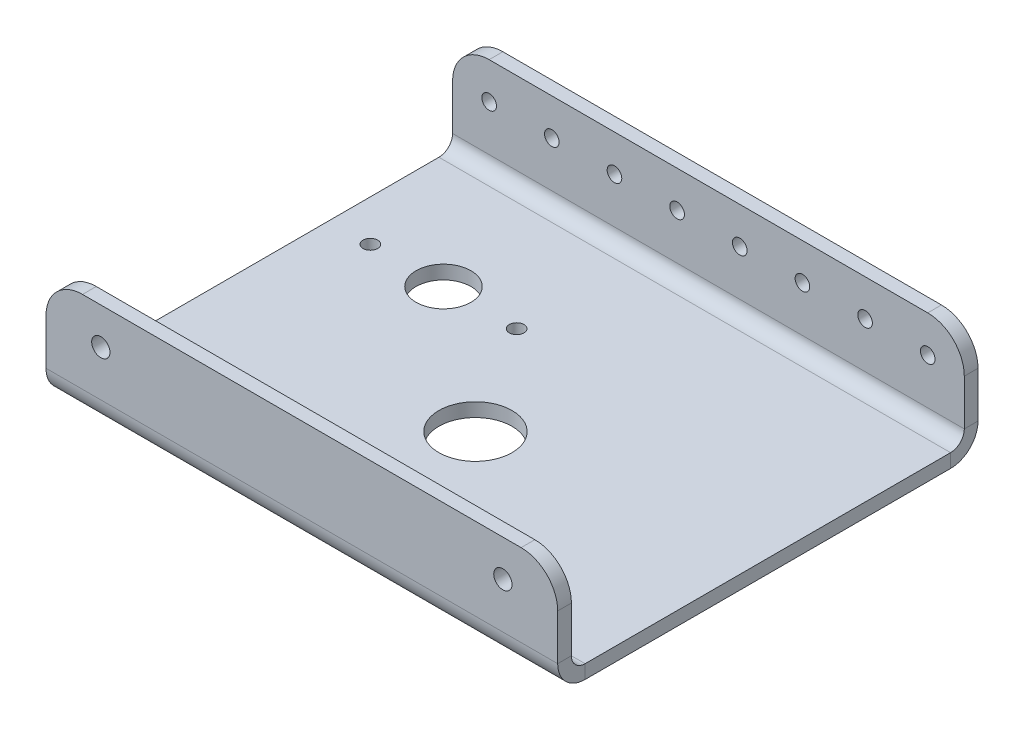
ISO-10303-21;
HEADER;
FILE_DESCRIPTION(('STEP AP214'),'2;1');
FILE_NAME('part.step','',(''),(''),'','','');
FILE_SCHEMA(('AUTOMOTIVE_DESIGN { 1 0 10303 214 1 1 1 1 }'));
ENDSEC;
DATA;
#1=APPLICATION_CONTEXT('core data for automotive mechanical design processes');
#2=APPLICATION_PROTOCOL_DEFINITION('international standard','automotive_design',2000,#1);
#3=PRODUCT_CONTEXT('',#1,'mechanical');
#4=PRODUCT('Part','Part','',(#3));
#5=PRODUCT_RELATED_PRODUCT_CATEGORY('part','',(#4));
#6=PRODUCT_DEFINITION_FORMATION('','',#4);
#7=PRODUCT_DEFINITION_CONTEXT('part definition',#1,'design');
#8=PRODUCT_DEFINITION('design','',#6,#7);
#9=PRODUCT_DEFINITION_SHAPE('','',#8);
#10=(LENGTH_UNIT() NAMED_UNIT(*) SI_UNIT(.MILLI.,.METRE.));
#11=(NAMED_UNIT(*) PLANE_ANGLE_UNIT() SI_UNIT($,.RADIAN.));
#12=(NAMED_UNIT(*) SI_UNIT($,.STERADIAN.) SOLID_ANGLE_UNIT());
#13=UNCERTAINTY_MEASURE_WITH_UNIT(LENGTH_MEASURE(1.E-05),#10,'distance_accuracy_value','');
#14=(GEOMETRIC_REPRESENTATION_CONTEXT(3) GLOBAL_UNCERTAINTY_ASSIGNED_CONTEXT((#13)) GLOBAL_UNIT_ASSIGNED_CONTEXT((#10,
#11,#12)) REPRESENTATION_CONTEXT('',''));
#15=CARTESIAN_POINT('',(0.,0.,0.));
#16=DIRECTION('',(0.,0.,1.));
#17=DIRECTION('',(1.,0.,0.));
#18=AXIS2_PLACEMENT_3D('',#15,#16,#17);
#19=CARTESIAN_POINT('',(-88.9,3.175,63.5));
#20=DIRECTION('',(1.,0.,0.));
#21=DIRECTION('',(0.,0.,1.));
#22=AXIS2_PLACEMENT_3D('',#19,#20,#21);
#23=PLANE('',#22);
#24=DIRECTION('',(0.,1.,0.));
#25=VECTOR('',#24,1.);
#26=CARTESIAN_POINT('',(-88.9,3.175,-63.5));
#27=LINE('',#26,#25);
#28=CARTESIAN_POINT('',(-88.9,-1.58750000000006,-63.5));
#29=VERTEX_POINT('',#28);
#30=CARTESIAN_POINT('',(-88.9,3.175,-63.5));
#31=VERTEX_POINT('',#30);
#32=EDGE_CURVE('E312',#29,#31,#27,.T.);
#33=ORIENTED_EDGE('',*,*,#32,.F.);
#34=DIRECTION('',(0.,0.,-1.));
#35=VECTOR('',#34,1.);
#36=CARTESIAN_POINT('',(-88.9,-1.5875,0.));
#37=LINE('',#36,#35);
#38=CARTESIAN_POINT('',(-88.9,-1.5875,63.5));
#39=VERTEX_POINT('',#38);
#40=EDGE_CURVE('E304',#29,#39,#37,.F.);
#41=ORIENTED_EDGE('',*,*,#40,.T.);
#42=DIRECTION('',(0.,1.,0.));
#43=VECTOR('',#42,1.);
#44=CARTESIAN_POINT('',(-88.9,3.175,63.5));
#45=LINE('',#44,#43);
#46=CARTESIAN_POINT('',(-88.9,3.175,63.5));
#47=VERTEX_POINT('',#46);
#48=EDGE_CURVE('E310',#39,#47,#45,.T.);
#49=ORIENTED_EDGE('',*,*,#48,.T.);
#50=DIRECTION('',(0.,0.,1.));
#51=VECTOR('',#50,1.);
#52=CARTESIAN_POINT('',(-88.9,3.175,63.5));
#53=LINE('',#52,#51);
#54=EDGE_CURVE('E293',#31,#47,#53,.T.);
#55=ORIENTED_EDGE('',*,*,#54,.F.);
#56=EDGE_LOOP('',(#33,#41,#49,#55));
#57=FACE_BOUND('',#56,.T.);
#58=ADVANCED_FACE('F77',(#57),#23,.F.);
#59=CARTESIAN_POINT('',(88.9,3.175,63.5));
#60=DIRECTION('',(-1.,0.,0.));
#61=DIRECTION('',(0.,0.,-1.));
#62=AXIS2_PLACEMENT_3D('',#59,#60,#61);
#63=PLANE('',#62);
#64=DIRECTION('',(0.,1.,0.));
#65=VECTOR('',#64,1.);
#66=CARTESIAN_POINT('',(88.9,3.175,63.5));
#67=LINE('',#66,#65);
#68=CARTESIAN_POINT('',(88.9,-1.58750000000001,63.5));
#69=VERTEX_POINT('',#68);
#70=CARTESIAN_POINT('',(88.9,3.175,63.5));
#71=VERTEX_POINT('',#70);
#72=EDGE_CURVE('E308',#69,#71,#67,.T.);
#73=ORIENTED_EDGE('',*,*,#72,.F.);
#74=DIRECTION('',(0.,0.,-1.));
#75=VECTOR('',#74,1.);
#76=CARTESIAN_POINT('',(88.9,-1.5875,0.));
#77=LINE('',#76,#75);
#78=CARTESIAN_POINT('',(88.9,-1.5875,-63.5));
#79=VERTEX_POINT('',#78);
#80=EDGE_CURVE('E279',#69,#79,#77,.T.);
#81=ORIENTED_EDGE('',*,*,#80,.T.);
#82=DIRECTION('',(0.,1.,0.));
#83=VECTOR('',#82,1.);
#84=CARTESIAN_POINT('',(88.9,3.175,-63.5));
#85=LINE('',#84,#83);
#86=CARTESIAN_POINT('',(88.9,3.175,-63.5));
#87=VERTEX_POINT('',#86);
#88=EDGE_CURVE('E299',#79,#87,#85,.T.);
#89=ORIENTED_EDGE('',*,*,#88,.T.);
#90=DIRECTION('',(0.,0.,-1.));
#91=VECTOR('',#90,1.);
#92=CARTESIAN_POINT('',(88.9,3.175,63.5));
#93=LINE('',#92,#91);
#94=EDGE_CURVE('E288',#71,#87,#93,.T.);
#95=ORIENTED_EDGE('',*,*,#94,.F.);
#96=EDGE_LOOP('',(#73,#81,#89,#95));
#97=FACE_BOUND('',#96,.T.);
#98=ADVANCED_FACE('F411',(#97),#63,.F.);
#99=CARTESIAN_POINT('',(0.,3.175,0.));
#100=DIRECTION('',(0.,-1.,0.));
#101=DIRECTION('',(0.,0.,-1.));
#102=AXIS2_PLACEMENT_3D('',#99,#100,#101);
#103=PLANE('',#102);
#104=CARTESIAN_POINT('',(-74.6032813946387,3.175,-25.4));
#105=DIRECTION('',(0.,-1.,0.));
#106=DIRECTION('',(0.,0.,-1.));
#107=AXIS2_PLACEMENT_3D('',#104,#105,#106);
#108=CIRCLE('',#107,2.53999999999998);
#109=CARTESIAN_POINT('',(-74.6032813946387,3.175,-27.94));
#110=VERTEX_POINT('',#109);
#111=EDGE_CURVE('E866',#110,#110,#108,.T.);
#112=ORIENTED_EDGE('',*,*,#111,.T.);
#113=EDGE_LOOP('',(#112));
#114=FACE_BOUND('',#113,.T.);
#115=CARTESIAN_POINT('',(-23.8032813946387,3.175,-25.4));
#116=DIRECTION('',(0.,-1.,0.));
#117=DIRECTION('',(0.,0.,-1.));
#118=AXIS2_PLACEMENT_3D('',#115,#116,#117);
#119=CIRCLE('',#118,2.54);
#120=CARTESIAN_POINT('',(-23.8032813946387,3.175,-27.94));
#121=VERTEX_POINT('',#120);
#122=EDGE_CURVE('E870',#121,#121,#119,.T.);
#123=ORIENTED_EDGE('',*,*,#122,.T.);
#124=EDGE_LOOP('',(#123));
#125=FACE_BOUND('',#124,.T.);
#126=CARTESIAN_POINT('',(-49.2032813946387,3.175,-25.4));
#127=DIRECTION('',(0.,-1.,0.));
#128=DIRECTION('',(0.,0.,-1.));
#129=AXIS2_PLACEMENT_3D('',#126,#127,#128);
#130=CIRCLE('',#129,9.525);
#131=CARTESIAN_POINT('',(-49.2032813946387,3.175,-34.925));
#132=VERTEX_POINT('',#131);
#133=EDGE_CURVE('E874',#132,#132,#130,.T.);
#134=ORIENTED_EDGE('',*,*,#133,.T.);
#135=EDGE_LOOP('',(#134));
#136=FACE_BOUND('',#135,.T.);
#137=CARTESIAN_POINT('',(0.,3.175,12.7));
#138=DIRECTION('',(0.,-1.,0.));
#139=DIRECTION('',(0.,0.,-1.));
#140=AXIS2_PLACEMENT_3D('',#137,#138,#139);
#141=CIRCLE('',#140,12.7);
#142=CARTESIAN_POINT('',(0.,3.175,0.));
#143=VERTEX_POINT('',#142);
#144=EDGE_CURVE('E877',#143,#143,#141,.T.);
#145=ORIENTED_EDGE('',*,*,#144,.T.);
#146=EDGE_LOOP('',(#145));
#147=FACE_BOUND('',#146,.T.);
#148=ORIENTED_EDGE('',*,*,#94,.T.);
#149=DIRECTION('',(-1.,0.,0.));
#150=VECTOR('',#149,1.);
#151=CARTESIAN_POINT('',(-88.9,3.175,-63.5));
#152=LINE('',#151,#150);
#153=EDGE_CURVE('E291',#87,#31,#152,.T.);
#154=ORIENTED_EDGE('',*,*,#153,.T.);
#155=ORIENTED_EDGE('',*,*,#54,.T.);
#156=DIRECTION('',(1.,0.,0.));
#157=VECTOR('',#156,1.);
#158=CARTESIAN_POINT('',(-88.9,3.175,63.5));
#159=LINE('',#158,#157);
#160=EDGE_CURVE('E296',#47,#71,#159,.T.);
#161=ORIENTED_EDGE('',*,*,#160,.T.);
#162=EDGE_LOOP('',(#148,#154,#155,#161));
#163=FACE_BOUND('',#162,.T.);
#164=ADVANCED_FACE('F414',(#114,#125,#136,#147,#163),#103,.F.);
#165=CARTESIAN_POINT('',(0.,-1.5875,0.));
#166=DIRECTION('',(0.,-1.,0.));
#167=DIRECTION('',(0.,0.,-1.));
#168=AXIS2_PLACEMENT_3D('',#165,#166,#167);
#169=PLANE('',#168);
#170=CARTESIAN_POINT('',(-74.6032813946387,-1.5875,-25.4));
#171=DIRECTION('',(0.,-1.,0.));
#172=DIRECTION('',(0.,0.,-1.));
#173=AXIS2_PLACEMENT_3D('',#170,#171,#172);
#174=CIRCLE('',#173,2.53999999999998);
#175=CARTESIAN_POINT('',(-74.6032813946387,-1.5875,-27.94));
#176=VERTEX_POINT('',#175);
#177=EDGE_CURVE('E962',#176,#176,#174,.T.);
#178=ORIENTED_EDGE('',*,*,#177,.F.);
#179=EDGE_LOOP('',(#178));
#180=FACE_BOUND('',#179,.T.);
#181=CARTESIAN_POINT('',(-23.8032813946387,-1.5875,-25.4));
#182=DIRECTION('',(0.,-1.,0.));
#183=DIRECTION('',(0.,0.,-1.));
#184=AXIS2_PLACEMENT_3D('',#181,#182,#183);
#185=CIRCLE('',#184,2.54);
#186=CARTESIAN_POINT('',(-23.8032813946387,-1.5875,-27.94));
#187=VERTEX_POINT('',#186);
#188=EDGE_CURVE('E958',#187,#187,#185,.T.);
#189=ORIENTED_EDGE('',*,*,#188,.F.);
#190=EDGE_LOOP('',(#189));
#191=FACE_BOUND('',#190,.T.);
#192=CARTESIAN_POINT('',(-49.2032813946387,-1.5875,-25.4));
#193=DIRECTION('',(0.,-1.,0.));
#194=DIRECTION('',(0.,0.,-1.));
#195=AXIS2_PLACEMENT_3D('',#192,#193,#194);
#196=CIRCLE('',#195,9.525);
#197=CARTESIAN_POINT('',(-49.2032813946387,-1.5875,-34.925));
#198=VERTEX_POINT('',#197);
#199=EDGE_CURVE('E954',#198,#198,#196,.T.);
#200=ORIENTED_EDGE('',*,*,#199,.F.);
#201=EDGE_LOOP('',(#200));
#202=FACE_BOUND('',#201,.T.);
#203=CARTESIAN_POINT('',(0.,-1.5875,12.7));
#204=DIRECTION('',(0.,-1.,0.));
#205=DIRECTION('',(0.,0.,-1.));
#206=AXIS2_PLACEMENT_3D('',#203,#204,#205);
#207=CIRCLE('',#206,12.7);
#208=CARTESIAN_POINT('',(0.,-1.5875,0.));
#209=VERTEX_POINT('',#208);
#210=EDGE_CURVE('E880',#209,#209,#207,.T.);
#211=ORIENTED_EDGE('',*,*,#210,.F.);
#212=EDGE_LOOP('',(#211));
#213=FACE_BOUND('',#212,.T.);
#214=ORIENTED_EDGE('',*,*,#80,.F.);
#215=DIRECTION('',(1.,0.,0.));
#216=VECTOR('',#215,1.);
#217=CARTESIAN_POINT('',(0.,-1.5875,63.5));
#218=LINE('',#217,#216);
#219=EDGE_CURVE('E201',#39,#69,#218,.T.);
#220=ORIENTED_EDGE('',*,*,#219,.F.);
#221=ORIENTED_EDGE('',*,*,#40,.F.);
#222=DIRECTION('',(1.,0.,0.));
#223=VECTOR('',#222,1.);
#224=CARTESIAN_POINT('',(0.,-1.5875,-63.5));
#225=LINE('',#224,#223);
#226=EDGE_CURVE('E302',#79,#29,#225,.F.);
#227=ORIENTED_EDGE('',*,*,#226,.F.);
#228=EDGE_LOOP('',(#214,#220,#221,#227));
#229=FACE_BOUND('',#228,.T.);
#230=ADVANCED_FACE('F700',(#180,#191,#202,#213,#229),#169,.T.);
#231=CARTESIAN_POINT('',(88.9,7.93749999999995,-63.5));
#232=DIRECTION('',(1.,0.,0.));
#233=DIRECTION('',(0.,0.,-1.));
#234=AXIS2_PLACEMENT_3D('',#231,#232,#233);
#235=PLANE('',#234);
#236=DIRECTION('',(0.,0.,1.));
#237=VECTOR('',#236,1.);
#238=CARTESIAN_POINT('',(88.9,7.93750000000001,-73.0249999999999));
#239=LINE('',#238,#237);
#240=CARTESIAN_POINT('',(88.9,7.93749999999993,-68.2625));
#241=VERTEX_POINT('',#240);
#242=CARTESIAN_POINT('',(88.9,7.93749999999991,-73.025));
#243=VERTEX_POINT('',#242);
#244=EDGE_CURVE('E248',#241,#243,#239,.F.);
#245=ORIENTED_EDGE('',*,*,#244,.F.);
#246=CARTESIAN_POINT('',(88.9,7.93749999999995,-63.5));
#247=DIRECTION('',(-1.,0.,0.));
#248=DIRECTION('',(0.,0.,1.));
#249=AXIS2_PLACEMENT_3D('',#246,#247,#248);
#250=CIRCLE('',#249,4.7625);
#251=EDGE_CURVE('E283',#87,#241,#250,.F.);
#252=ORIENTED_EDGE('',*,*,#251,.F.);
#253=ORIENTED_EDGE('',*,*,#88,.F.);
#254=CARTESIAN_POINT('',(88.9,7.93749999999995,-63.5));
#255=DIRECTION('',(-1.,0.,0.));
#256=DIRECTION('',(0.,0.,1.));
#257=AXIS2_PLACEMENT_3D('',#254,#255,#256);
#258=CIRCLE('',#257,9.525);
#259=EDGE_CURVE('E276',#79,#243,#258,.F.);
#260=ORIENTED_EDGE('',*,*,#259,.T.);
#261=EDGE_LOOP('',(#245,#252,#253,#260));
#262=FACE_BOUND('',#261,.T.);
#263=ADVANCED_FACE('F407',(#262),#235,.T.);
#264=CARTESIAN_POINT('',(-88.9,7.93749999999995,-63.5));
#265=DIRECTION('',(1.,0.,0.));
#266=DIRECTION('',(0.,0.,-1.));
#267=AXIS2_PLACEMENT_3D('',#264,#265,#266);
#268=PLANE('',#267);
#269=CARTESIAN_POINT('',(-88.9,7.93749999999995,-63.5));
#270=DIRECTION('',(-1.,0.,0.));
#271=DIRECTION('',(0.,0.,1.));
#272=AXIS2_PLACEMENT_3D('',#269,#270,#271);
#273=CIRCLE('',#272,4.7625);
#274=CARTESIAN_POINT('',(-88.9,7.93749999999993,-68.2625));
#275=VERTEX_POINT('',#274);
#276=EDGE_CURVE('E255',#275,#31,#273,.T.);
#277=ORIENTED_EDGE('',*,*,#276,.F.);
#278=DIRECTION('',(0.,0.,1.));
#279=VECTOR('',#278,1.);
#280=CARTESIAN_POINT('',(-88.9,7.93749999999998,-68.2625));
#281=LINE('',#280,#279);
#282=CARTESIAN_POINT('',(-88.9,7.93750000000001,-73.025));
#283=VERTEX_POINT('',#282);
#284=EDGE_CURVE('E269',#275,#283,#281,.F.);
#285=ORIENTED_EDGE('',*,*,#284,.T.);
#286=CARTESIAN_POINT('',(-88.9,7.93749999999995,-63.5));
#287=DIRECTION('',(-1.,0.,0.));
#288=DIRECTION('',(0.,0.,1.));
#289=AXIS2_PLACEMENT_3D('',#286,#287,#288);
#290=CIRCLE('',#289,9.525);
#291=EDGE_CURVE('E280',#283,#29,#290,.T.);
#292=ORIENTED_EDGE('',*,*,#291,.T.);
#293=ORIENTED_EDGE('',*,*,#32,.T.);
#294=EDGE_LOOP('',(#277,#285,#292,#293));
#295=FACE_BOUND('',#294,.T.);
#296=ADVANCED_FACE('F401',(#295),#268,.F.);
#297=CARTESIAN_POINT('',(-88.9,7.93749999999995,-63.5));
#298=DIRECTION('',(-1.,0.,0.));
#299=DIRECTION('',(0.,0.,-1.));
#300=AXIS2_PLACEMENT_3D('',#297,#298,#299);
#301=CYLINDRICAL_SURFACE('',#300,9.525);
#302=ORIENTED_EDGE('',*,*,#226,.T.);
#303=ORIENTED_EDGE('',*,*,#291,.F.);
#304=DIRECTION('',(-1.,0.,0.));
#305=VECTOR('',#304,1.);
#306=CARTESIAN_POINT('',(88.9,7.93750000000001,-73.025));
#307=LINE('',#306,#305);
#308=EDGE_CURVE('E266',#283,#243,#307,.F.);
#309=ORIENTED_EDGE('',*,*,#308,.T.);
#310=ORIENTED_EDGE('',*,*,#259,.F.);
#311=EDGE_LOOP('',(#302,#303,#309,#310));
#312=FACE_BOUND('',#311,.T.);
#313=ADVANCED_FACE('F404',(#312),#301,.T.);
#314=CARTESIAN_POINT('',(-88.9,7.93749999999995,-63.5));
#315=DIRECTION('',(-1.,0.,0.));
#316=DIRECTION('',(0.,0.,-1.));
#317=AXIS2_PLACEMENT_3D('',#314,#315,#316);
#318=CYLINDRICAL_SURFACE('',#317,4.7625);
#319=ORIENTED_EDGE('',*,*,#153,.F.);
#320=ORIENTED_EDGE('',*,*,#251,.T.);
#321=DIRECTION('',(-1.,0.,0.));
#322=VECTOR('',#321,1.);
#323=CARTESIAN_POINT('',(88.9,7.93749999999998,-68.2625));
#324=LINE('',#323,#322);
#325=EDGE_CURVE('E272',#241,#275,#324,.T.);
#326=ORIENTED_EDGE('',*,*,#325,.T.);
#327=ORIENTED_EDGE('',*,*,#276,.T.);
#328=EDGE_LOOP('',(#319,#320,#326,#327));
#329=FACE_BOUND('',#328,.T.);
#330=ADVANCED_FACE('F418',(#329),#318,.F.);
#331=CARTESIAN_POINT('',(88.9,3.17499999999998,-73.025));
#332=DIRECTION('',(-1.,0.,0.));
#333=DIRECTION('',(0.,0.,1.));
#334=AXIS2_PLACEMENT_3D('',#331,#332,#333);
#335=PLANE('',#334);
#336=DIRECTION('',(0.,-1.,0.));
#337=VECTOR('',#336,1.);
#338=CARTESIAN_POINT('',(88.9,-2.28099232185794E-13,-73.025));
#339=LINE('',#338,#337);
#340=CARTESIAN_POINT('',(88.9,23.8125,-73.025));
#341=VERTEX_POINT('',#340);
#342=EDGE_CURVE('E258',#341,#243,#339,.T.);
#343=ORIENTED_EDGE('',*,*,#342,.F.);
#344=DIRECTION('',(0.,0.,1.));
#345=VECTOR('',#344,1.);
#346=CARTESIAN_POINT('',(88.9,23.8125,-73.025));
#347=LINE('',#346,#345);
#348=CARTESIAN_POINT('',(88.9,23.8125,-68.2625));
#349=VERTEX_POINT('',#348);
#350=EDGE_CURVE('E364',#341,#349,#347,.T.);
#351=ORIENTED_EDGE('',*,*,#350,.T.);
#352=DIRECTION('',(0.,1.,0.));
#353=VECTOR('',#352,1.);
#354=CARTESIAN_POINT('',(88.9,3.175,-68.2625));
#355=LINE('',#354,#353);
#356=EDGE_CURVE('E264',#349,#241,#355,.F.);
#357=ORIENTED_EDGE('',*,*,#356,.T.);
#358=ORIENTED_EDGE('',*,*,#244,.T.);
#359=EDGE_LOOP('',(#343,#351,#357,#358));
#360=FACE_BOUND('',#359,.T.);
#361=ADVANCED_FACE('F384',(#360),#335,.F.);
#362=CARTESIAN_POINT('',(-88.9,36.5125,-73.0250000000001));
#363=DIRECTION('',(1.,0.,0.));
#364=DIRECTION('',(0.,0.,-1.));
#365=AXIS2_PLACEMENT_3D('',#362,#363,#364);
#366=PLANE('',#365);
#367=DIRECTION('',(0.,-1.,0.));
#368=VECTOR('',#367,1.);
#369=CARTESIAN_POINT('',(-88.9,36.5125,-68.2625000000001));
#370=LINE('',#369,#368);
#371=CARTESIAN_POINT('',(-88.9,23.8125,-68.2625));
#372=VERTEX_POINT('',#371);
#373=EDGE_CURVE('E262',#275,#372,#370,.F.);
#374=ORIENTED_EDGE('',*,*,#373,.T.);
#375=DIRECTION('',(0.,0.,1.));
#376=VECTOR('',#375,1.);
#377=CARTESIAN_POINT('',(-88.9,23.8125,-73.025));
#378=LINE('',#377,#376);
#379=CARTESIAN_POINT('',(-88.9,23.8125,-73.025));
#380=VERTEX_POINT('',#379);
#381=EDGE_CURVE('E13',#372,#380,#378,.F.);
#382=ORIENTED_EDGE('',*,*,#381,.T.);
#383=DIRECTION('',(0.,1.,0.));
#384=VECTOR('',#383,1.);
#385=CARTESIAN_POINT('',(-88.9,-2.28099232185794E-13,-73.025));
#386=LINE('',#385,#384);
#387=EDGE_CURVE('E256',#283,#380,#386,.T.);
#388=ORIENTED_EDGE('',*,*,#387,.F.);
#389=ORIENTED_EDGE('',*,*,#284,.F.);
#390=EDGE_LOOP('',(#374,#382,#388,#389));
#391=FACE_BOUND('',#390,.T.);
#392=ADVANCED_FACE('F398',(#391),#366,.F.);
#393=CARTESIAN_POINT('',(0.,-2.28099232185794E-13,-73.025));
#394=DIRECTION('',(0.,0.,1.));
#395=DIRECTION('',(0.,-1.,0.));
#396=AXIS2_PLACEMENT_3D('',#393,#394,#395);
#397=PLANE('',#396);
#398=CARTESIAN_POINT('',(-76.2,23.8125,-73.025));
#399=DIRECTION('',(0.,0.,-1.));
#400=DIRECTION('',(0.,1.,0.));
#401=AXIS2_PLACEMENT_3D('',#398,#399,#400);
#402=CIRCLE('',#401,2.54);
#403=CARTESIAN_POINT('',(-76.2,26.3525,-73.0250000000001));
#404=VERTEX_POINT('',#403);
#405=EDGE_CURVE('E347',#404,#404,#402,.T.);
#406=ORIENTED_EDGE('',*,*,#405,.F.);
#407=EDGE_LOOP('',(#406));
#408=FACE_BOUND('',#407,.T.);
#409=CARTESIAN_POINT('',(-54.4285714285714,23.8125,-73.025));
#410=DIRECTION('',(0.,0.,-1.));
#411=DIRECTION('',(0.,1.,0.));
#412=AXIS2_PLACEMENT_3D('',#409,#410,#411);
#413=CIRCLE('',#412,2.54);
#414=CARTESIAN_POINT('',(-54.4285714285714,26.3525,-73.0250000000001));
#415=VERTEX_POINT('',#414);
#416=EDGE_CURVE('E343',#415,#415,#413,.T.);
#417=ORIENTED_EDGE('',*,*,#416,.F.);
#418=EDGE_LOOP('',(#417));
#419=FACE_BOUND('',#418,.T.);
#420=CARTESIAN_POINT('',(-32.6571428571429,23.8125,-73.025));
#421=DIRECTION('',(0.,0.,-1.));
#422=DIRECTION('',(0.,1.,0.));
#423=AXIS2_PLACEMENT_3D('',#420,#421,#422);
#424=CIRCLE('',#423,2.54);
#425=CARTESIAN_POINT('',(-32.6571428571429,26.3525,-73.0250000000001));
#426=VERTEX_POINT('',#425);
#427=EDGE_CURVE('E339',#426,#426,#424,.T.);
#428=ORIENTED_EDGE('',*,*,#427,.F.);
#429=EDGE_LOOP('',(#428));
#430=FACE_BOUND('',#429,.T.);
#431=CARTESIAN_POINT('',(-10.8857142857143,23.8125,-73.025));
#432=DIRECTION('',(0.,0.,-1.));
#433=DIRECTION('',(0.,1.,0.));
#434=AXIS2_PLACEMENT_3D('',#431,#432,#433);
#435=CIRCLE('',#434,2.54);
#436=CARTESIAN_POINT('',(-10.8857142857143,26.3525,-73.0250000000001));
#437=VERTEX_POINT('',#436);
#438=EDGE_CURVE('E335',#437,#437,#435,.T.);
#439=ORIENTED_EDGE('',*,*,#438,.F.);
#440=EDGE_LOOP('',(#439));
#441=FACE_BOUND('',#440,.T.);
#442=CARTESIAN_POINT('',(10.8857142857143,23.8125,-73.025));
#443=DIRECTION('',(0.,0.,-1.));
#444=DIRECTION('',(0.,1.,0.));
#445=AXIS2_PLACEMENT_3D('',#442,#443,#444);
#446=CIRCLE('',#445,2.54);
#447=CARTESIAN_POINT('',(10.8857142857143,26.3525,-73.0250000000001));
#448=VERTEX_POINT('',#447);
#449=EDGE_CURVE('E331',#448,#448,#446,.T.);
#450=ORIENTED_EDGE('',*,*,#449,.F.);
#451=EDGE_LOOP('',(#450));
#452=FACE_BOUND('',#451,.T.);
#453=CARTESIAN_POINT('',(32.6571428571428,23.8125,-73.025));
#454=DIRECTION('',(0.,0.,-1.));
#455=DIRECTION('',(0.,1.,0.));
#456=AXIS2_PLACEMENT_3D('',#453,#454,#455);
#457=CIRCLE('',#456,2.54);
#458=CARTESIAN_POINT('',(32.6571428571428,26.3525,-73.0250000000001));
#459=VERTEX_POINT('',#458);
#460=EDGE_CURVE('E327',#459,#459,#457,.T.);
#461=ORIENTED_EDGE('',*,*,#460,.F.);
#462=EDGE_LOOP('',(#461));
#463=FACE_BOUND('',#462,.T.);
#464=CARTESIAN_POINT('',(54.4285714285714,23.8125,-73.025));
#465=DIRECTION('',(0.,0.,-1.));
#466=DIRECTION('',(0.,1.,0.));
#467=AXIS2_PLACEMENT_3D('',#464,#465,#466);
#468=CIRCLE('',#467,2.53999999999999);
#469=CARTESIAN_POINT('',(54.4285714285714,26.3525,-73.0250000000001));
#470=VERTEX_POINT('',#469);
#471=EDGE_CURVE('E323',#470,#470,#468,.T.);
#472=ORIENTED_EDGE('',*,*,#471,.F.);
#473=EDGE_LOOP('',(#472));
#474=FACE_BOUND('',#473,.T.);
#475=CARTESIAN_POINT('',(76.2,23.8125,-73.025));
#476=DIRECTION('',(0.,0.,-1.));
#477=DIRECTION('',(0.,1.,0.));
#478=AXIS2_PLACEMENT_3D('',#475,#476,#477);
#479=CIRCLE('',#478,2.54);
#480=CARTESIAN_POINT('',(76.2,26.3525,-73.0250000000001));
#481=VERTEX_POINT('',#480);
#482=EDGE_CURVE('E319',#481,#481,#479,.T.);
#483=ORIENTED_EDGE('',*,*,#482,.F.);
#484=EDGE_LOOP('',(#483));
#485=FACE_BOUND('',#484,.T.);
#486=DIRECTION('',(1.,0.,0.));
#487=VECTOR('',#486,1.);
#488=CARTESIAN_POINT('',(0.,36.5125,-73.0250000000001));
#489=LINE('',#488,#487);
#490=CARTESIAN_POINT('',(-76.2,36.5125,-73.0250000000001));
#491=VERTEX_POINT('',#490);
#492=CARTESIAN_POINT('',(76.2,36.5125,-73.0250000000001));
#493=VERTEX_POINT('',#492);
#494=EDGE_CURVE('E253',#491,#493,#489,.T.);
#495=ORIENTED_EDGE('',*,*,#494,.T.);
#496=CARTESIAN_POINT('',(76.2,23.8125,-73.025));
#497=DIRECTION('',(0.,0.,1.));
#498=DIRECTION('',(0.,-1.,0.));
#499=AXIS2_PLACEMENT_3D('',#496,#497,#498);
#500=CIRCLE('',#499,12.7);
#501=EDGE_CURVE('E85',#493,#341,#500,.F.);
#502=ORIENTED_EDGE('',*,*,#501,.T.);
#503=ORIENTED_EDGE('',*,*,#342,.T.);
#504=ORIENTED_EDGE('',*,*,#308,.F.);
#505=ORIENTED_EDGE('',*,*,#387,.T.);
#506=CARTESIAN_POINT('',(-76.2,23.8125,-73.025));
#507=DIRECTION('',(0.,0.,1.));
#508=DIRECTION('',(0.,-1.,0.));
#509=AXIS2_PLACEMENT_3D('',#506,#507,#508);
#510=CIRCLE('',#509,12.7);
#511=EDGE_CURVE('E375',#380,#491,#510,.F.);
#512=ORIENTED_EDGE('',*,*,#511,.T.);
#513=EDGE_LOOP('',(#495,#502,#503,#504,#505,#512));
#514=FACE_BOUND('',#513,.T.);
#515=ADVANCED_FACE('F379',(#408,#419,#430,#441,#452,#463,#474,#485,#514),#397,.F.);
#516=CARTESIAN_POINT('',(0.,-2.11471052309553E-13,-68.2625));
#517=DIRECTION('',(0.,0.,1.));
#518=DIRECTION('',(0.,-1.,0.));
#519=AXIS2_PLACEMENT_3D('',#516,#517,#518);
#520=PLANE('',#519);
#521=CARTESIAN_POINT('',(-76.2,23.8125,-68.2625));
#522=DIRECTION('',(0.,0.,1.));
#523=DIRECTION('',(0.,-1.,0.));
#524=AXIS2_PLACEMENT_3D('',#521,#522,#523);
#525=CIRCLE('',#524,2.54);
#526=CARTESIAN_POINT('',(-76.2,21.2725,-68.2625));
#527=VERTEX_POINT('',#526);
#528=EDGE_CURVE('E344',#527,#527,#525,.T.);
#529=ORIENTED_EDGE('',*,*,#528,.F.);
#530=EDGE_LOOP('',(#529));
#531=FACE_BOUND('',#530,.T.);
#532=CARTESIAN_POINT('',(-54.4285714285714,23.8125,-68.2625));
#533=DIRECTION('',(0.,0.,1.));
#534=DIRECTION('',(0.,-1.,0.));
#535=AXIS2_PLACEMENT_3D('',#532,#533,#534);
#536=CIRCLE('',#535,2.54);
#537=CARTESIAN_POINT('',(-54.4285714285714,21.2725,-68.2625));
#538=VERTEX_POINT('',#537);
#539=EDGE_CURVE('E340',#538,#538,#536,.T.);
#540=ORIENTED_EDGE('',*,*,#539,.F.);
#541=EDGE_LOOP('',(#540));
#542=FACE_BOUND('',#541,.T.);
#543=CARTESIAN_POINT('',(-32.6571428571429,23.8125,-68.2625));
#544=DIRECTION('',(0.,0.,1.));
#545=DIRECTION('',(0.,-1.,0.));
#546=AXIS2_PLACEMENT_3D('',#543,#544,#545);
#547=CIRCLE('',#546,2.54);
#548=CARTESIAN_POINT('',(-32.6571428571429,21.2725,-68.2625));
#549=VERTEX_POINT('',#548);
#550=EDGE_CURVE('E336',#549,#549,#547,.T.);
#551=ORIENTED_EDGE('',*,*,#550,.F.);
#552=EDGE_LOOP('',(#551));
#553=FACE_BOUND('',#552,.T.);
#554=CARTESIAN_POINT('',(-10.8857142857143,23.8125,-68.2625));
#555=DIRECTION('',(0.,0.,1.));
#556=DIRECTION('',(0.,-1.,0.));
#557=AXIS2_PLACEMENT_3D('',#554,#555,#556);
#558=CIRCLE('',#557,2.54);
#559=CARTESIAN_POINT('',(-10.8857142857143,21.2725,-68.2625));
#560=VERTEX_POINT('',#559);
#561=EDGE_CURVE('E332',#560,#560,#558,.T.);
#562=ORIENTED_EDGE('',*,*,#561,.F.);
#563=EDGE_LOOP('',(#562));
#564=FACE_BOUND('',#563,.T.);
#565=CARTESIAN_POINT('',(10.8857142857143,23.8125,-68.2625));
#566=DIRECTION('',(0.,0.,1.));
#567=DIRECTION('',(0.,-1.,0.));
#568=AXIS2_PLACEMENT_3D('',#565,#566,#567);
#569=CIRCLE('',#568,2.54);
#570=CARTESIAN_POINT('',(10.8857142857143,21.2725,-68.2625));
#571=VERTEX_POINT('',#570);
#572=EDGE_CURVE('E328',#571,#571,#569,.T.);
#573=ORIENTED_EDGE('',*,*,#572,.F.);
#574=EDGE_LOOP('',(#573));
#575=FACE_BOUND('',#574,.T.);
#576=CARTESIAN_POINT('',(32.6571428571428,23.8125,-68.2625));
#577=DIRECTION('',(0.,0.,1.));
#578=DIRECTION('',(0.,-1.,0.));
#579=AXIS2_PLACEMENT_3D('',#576,#577,#578);
#580=CIRCLE('',#579,2.54);
#581=CARTESIAN_POINT('',(32.6571428571428,21.2725,-68.2625));
#582=VERTEX_POINT('',#581);
#583=EDGE_CURVE('E324',#582,#582,#580,.T.);
#584=ORIENTED_EDGE('',*,*,#583,.F.);
#585=EDGE_LOOP('',(#584));
#586=FACE_BOUND('',#585,.T.);
#587=CARTESIAN_POINT('',(54.4285714285714,23.8125,-68.2625));
#588=DIRECTION('',(0.,0.,1.));
#589=DIRECTION('',(0.,-1.,0.));
#590=AXIS2_PLACEMENT_3D('',#587,#588,#589);
#591=CIRCLE('',#590,2.53999999999999);
#592=CARTESIAN_POINT('',(54.4285714285714,21.2725,-68.2625));
#593=VERTEX_POINT('',#592);
#594=EDGE_CURVE('E320',#593,#593,#591,.T.);
#595=ORIENTED_EDGE('',*,*,#594,.F.);
#596=EDGE_LOOP('',(#595));
#597=FACE_BOUND('',#596,.T.);
#598=CARTESIAN_POINT('',(76.2,23.8125,-68.2625));
#599=DIRECTION('',(0.,0.,1.));
#600=DIRECTION('',(0.,-1.,0.));
#601=AXIS2_PLACEMENT_3D('',#598,#599,#600);
#602=CIRCLE('',#601,2.54);
#603=CARTESIAN_POINT('',(76.2,21.2725,-68.2625));
#604=VERTEX_POINT('',#603);
#605=EDGE_CURVE('E247',#604,#604,#602,.T.);
#606=ORIENTED_EDGE('',*,*,#605,.F.);
#607=EDGE_LOOP('',(#606));
#608=FACE_BOUND('',#607,.T.);
#609=ORIENTED_EDGE('',*,*,#356,.F.);
#610=CARTESIAN_POINT('',(76.2,23.8125,-68.2625));
#611=DIRECTION('',(0.,0.,1.));
#612=DIRECTION('',(0.,-1.,0.));
#613=AXIS2_PLACEMENT_3D('',#610,#611,#612);
#614=CIRCLE('',#613,12.7);
#615=CARTESIAN_POINT('',(76.2,36.5125,-68.2625000000001));
#616=VERTEX_POINT('',#615);
#617=EDGE_CURVE('E369',#349,#616,#614,.T.);
#618=ORIENTED_EDGE('',*,*,#617,.T.);
#619=DIRECTION('',(-1.,0.,0.));
#620=VECTOR('',#619,1.);
#621=CARTESIAN_POINT('',(88.9,36.5125,-68.2625000000001));
#622=LINE('',#621,#620);
#623=CARTESIAN_POINT('',(-76.2,36.5125,-68.2625000000001));
#624=VERTEX_POINT('',#623);
#625=EDGE_CURVE('E260',#624,#616,#622,.F.);
#626=ORIENTED_EDGE('',*,*,#625,.F.);
#627=CARTESIAN_POINT('',(-76.2,23.8125,-68.2625));
#628=DIRECTION('',(0.,0.,1.));
#629=DIRECTION('',(0.,-1.,0.));
#630=AXIS2_PLACEMENT_3D('',#627,#628,#629);
#631=CIRCLE('',#630,12.7);
#632=EDGE_CURVE('E367',#624,#372,#631,.T.);
#633=ORIENTED_EDGE('',*,*,#632,.T.);
#634=ORIENTED_EDGE('',*,*,#373,.F.);
#635=ORIENTED_EDGE('',*,*,#325,.F.);
#636=EDGE_LOOP('',(#609,#618,#626,#633,#634,#635));
#637=FACE_BOUND('',#636,.T.);
#638=ADVANCED_FACE('F390',(#531,#542,#553,#564,#575,#586,#597,#608,#637),#520,.T.);
#639=CARTESIAN_POINT('',(88.9,36.5125,-73.0250000000001));
#640=DIRECTION('',(0.,-1.,0.));
#641=DIRECTION('',(0.,0.,-1.));
#642=AXIS2_PLACEMENT_3D('',#639,#640,#641);
#643=PLANE('',#642);
#644=ORIENTED_EDGE('',*,*,#625,.T.);
#645=DIRECTION('',(0.,0.,1.));
#646=VECTOR('',#645,1.);
#647=CARTESIAN_POINT('',(76.2,36.5125,-73.0250000000001));
#648=LINE('',#647,#646);
#649=EDGE_CURVE('E98',#616,#493,#648,.F.);
#650=ORIENTED_EDGE('',*,*,#649,.T.);
#651=ORIENTED_EDGE('',*,*,#494,.F.);
#652=DIRECTION('',(0.,0.,1.));
#653=VECTOR('',#652,1.);
#654=CARTESIAN_POINT('',(-76.2,36.5125,-73.0250000000001));
#655=LINE('',#654,#653);
#656=EDGE_CURVE('E371',#491,#624,#655,.T.);
#657=ORIENTED_EDGE('',*,*,#656,.T.);
#658=EDGE_LOOP('',(#644,#650,#651,#657));
#659=FACE_BOUND('',#658,.T.);
#660=ADVANCED_FACE('F392',(#659),#643,.F.);
#661=CARTESIAN_POINT('',(-88.9,7.93749999999998,63.5));
#662=DIRECTION('',(-1.,0.,0.));
#663=DIRECTION('',(0.,0.,1.));
#664=AXIS2_PLACEMENT_3D('',#661,#662,#663);
#665=PLANE('',#664);
#666=DIRECTION('',(0.,0.,-1.));
#667=VECTOR('',#666,1.);
#668=CARTESIAN_POINT('',(-88.9,7.93749999999998,73.025));
#669=LINE('',#668,#667);
#670=CARTESIAN_POINT('',(-88.9,7.93749999999998,68.2625));
#671=VERTEX_POINT('',#670);
#672=CARTESIAN_POINT('',(-88.9,7.93749999999998,73.025));
#673=VERTEX_POINT('',#672);
#674=EDGE_CURVE('E244',#671,#673,#669,.F.);
#675=ORIENTED_EDGE('',*,*,#674,.F.);
#676=CARTESIAN_POINT('',(-88.9,7.93749999999998,63.5));
#677=DIRECTION('',(1.,0.,0.));
#678=DIRECTION('',(0.,0.,-1.));
#679=AXIS2_PLACEMENT_3D('',#676,#677,#678);
#680=CIRCLE('',#679,4.76249999999999);
#681=EDGE_CURVE('E205',#47,#671,#680,.F.);
#682=ORIENTED_EDGE('',*,*,#681,.F.);
#683=ORIENTED_EDGE('',*,*,#48,.F.);
#684=CARTESIAN_POINT('',(-88.9,7.93749999999998,63.5));
#685=DIRECTION('',(1.,0.,0.));
#686=DIRECTION('',(0.,0.,-1.));
#687=AXIS2_PLACEMENT_3D('',#684,#685,#686);
#688=CIRCLE('',#687,9.52499999999999);
#689=EDGE_CURVE('E204',#39,#673,#688,.F.);
#690=ORIENTED_EDGE('',*,*,#689,.T.);
#691=EDGE_LOOP('',(#675,#682,#683,#690));
#692=FACE_BOUND('',#691,.T.);
#693=ADVANCED_FACE('F521',(#692),#665,.T.);
#694=CARTESIAN_POINT('',(88.9,7.93749999999998,63.5));
#695=DIRECTION('',(-1.,0.,0.));
#696=DIRECTION('',(0.,0.,1.));
#697=AXIS2_PLACEMENT_3D('',#694,#695,#696);
#698=PLANE('',#697);
#699=CARTESIAN_POINT('',(88.9,7.93749999999998,63.5));
#700=DIRECTION('',(1.,0.,0.));
#701=DIRECTION('',(0.,0.,-1.));
#702=AXIS2_PLACEMENT_3D('',#699,#700,#701);
#703=CIRCLE('',#702,4.76249999999999);
#704=CARTESIAN_POINT('',(88.9,7.93749999999998,68.2625));
#705=VERTEX_POINT('',#704);
#706=EDGE_CURVE('E212',#705,#71,#703,.T.);
#707=ORIENTED_EDGE('',*,*,#706,.F.);
#708=DIRECTION('',(0.,0.,-1.));
#709=VECTOR('',#708,1.);
#710=CARTESIAN_POINT('',(88.8999999999999,7.93749999999998,68.2625));
#711=LINE('',#710,#709);
#712=CARTESIAN_POINT('',(88.9,7.93749999999998,73.025));
#713=VERTEX_POINT('',#712);
#714=EDGE_CURVE('E209',#705,#713,#711,.F.);
#715=ORIENTED_EDGE('',*,*,#714,.T.);
#716=CARTESIAN_POINT('',(88.9,7.93749999999998,63.5));
#717=DIRECTION('',(1.,0.,0.));
#718=DIRECTION('',(0.,0.,-1.));
#719=AXIS2_PLACEMENT_3D('',#716,#717,#718);
#720=CIRCLE('',#719,9.52499999999999);
#721=EDGE_CURVE('E193',#713,#69,#720,.T.);
#722=ORIENTED_EDGE('',*,*,#721,.T.);
#723=ORIENTED_EDGE('',*,*,#72,.T.);
#724=EDGE_LOOP('',(#707,#715,#722,#723));
#725=FACE_BOUND('',#724,.T.);
#726=ADVANCED_FACE('F210',(#725),#698,.F.);
#727=CARTESIAN_POINT('',(88.9,7.93749999999998,63.5));
#728=DIRECTION('',(1.,0.,0.));
#729=DIRECTION('',(0.,0.,1.));
#730=AXIS2_PLACEMENT_3D('',#727,#728,#729);
#731=CYLINDRICAL_SURFACE('',#730,9.52499999999999);
#732=ORIENTED_EDGE('',*,*,#219,.T.);
#733=ORIENTED_EDGE('',*,*,#721,.F.);
#734=DIRECTION('',(1.,0.,0.));
#735=VECTOR('',#734,1.);
#736=CARTESIAN_POINT('',(-88.9,7.93749999999998,73.025));
#737=LINE('',#736,#735);
#738=EDGE_CURVE('E198',#713,#673,#737,.F.);
#739=ORIENTED_EDGE('',*,*,#738,.T.);
#740=ORIENTED_EDGE('',*,*,#689,.F.);
#741=EDGE_LOOP('',(#732,#733,#739,#740));
#742=FACE_BOUND('',#741,.T.);
#743=ADVANCED_FACE('F195',(#742),#731,.T.);
#744=CARTESIAN_POINT('',(88.9,7.93749999999998,63.5));
#745=DIRECTION('',(1.,0.,0.));
#746=DIRECTION('',(0.,0.,1.));
#747=AXIS2_PLACEMENT_3D('',#744,#745,#746);
#748=CYLINDRICAL_SURFACE('',#747,4.76249999999999);
#749=ORIENTED_EDGE('',*,*,#160,.F.);
#750=ORIENTED_EDGE('',*,*,#681,.T.);
#751=DIRECTION('',(1.,0.,0.));
#752=VECTOR('',#751,1.);
#753=CARTESIAN_POINT('',(-88.9,7.93749999999998,68.2625));
#754=LINE('',#753,#752);
#755=EDGE_CURVE('E217',#671,#705,#754,.T.);
#756=ORIENTED_EDGE('',*,*,#755,.T.);
#757=ORIENTED_EDGE('',*,*,#706,.T.);
#758=EDGE_LOOP('',(#749,#750,#756,#757));
#759=FACE_BOUND('',#758,.T.);
#760=ADVANCED_FACE('F515',(#759),#748,.F.);
#761=CARTESIAN_POINT('',(88.9,36.5125,73.025));
#762=DIRECTION('',(-1.,0.,0.));
#763=DIRECTION('',(0.,0.,1.));
#764=AXIS2_PLACEMENT_3D('',#761,#762,#763);
#765=PLANE('',#764);
#766=DIRECTION('',(0.,-1.,0.));
#767=VECTOR('',#766,1.);
#768=CARTESIAN_POINT('',(88.9,36.5125,68.2625));
#769=LINE('',#768,#767);
#770=CARTESIAN_POINT('',(88.9,23.8125,68.2625));
#771=VERTEX_POINT('',#770);
#772=EDGE_CURVE('E227',#705,#771,#769,.F.);
#773=ORIENTED_EDGE('',*,*,#772,.T.);
#774=DIRECTION('',(0.,0.,-1.));
#775=VECTOR('',#774,1.);
#776=CARTESIAN_POINT('',(88.9,23.8125,73.025));
#777=LINE('',#776,#775);
#778=CARTESIAN_POINT('',(88.9,23.8125,73.025));
#779=VERTEX_POINT('',#778);
#780=EDGE_CURVE('E231',#771,#779,#777,.F.);
#781=ORIENTED_EDGE('',*,*,#780,.T.);
#782=DIRECTION('',(0.,1.,0.));
#783=VECTOR('',#782,1.);
#784=CARTESIAN_POINT('',(88.9,0.,73.025));
#785=LINE('',#784,#783);
#786=EDGE_CURVE('E223',#713,#779,#785,.T.);
#787=ORIENTED_EDGE('',*,*,#786,.F.);
#788=ORIENTED_EDGE('',*,*,#714,.F.);
#789=EDGE_LOOP('',(#773,#781,#787,#788));
#790=FACE_BOUND('',#789,.T.);
#791=ADVANCED_FACE('F229',(#790),#765,.F.);
#792=CARTESIAN_POINT('',(-88.9,3.175,73.025));
#793=DIRECTION('',(1.,0.,0.));
#794=DIRECTION('',(0.,0.,-1.));
#795=AXIS2_PLACEMENT_3D('',#792,#793,#794);
#796=PLANE('',#795);
#797=DIRECTION('',(0.,-1.,0.));
#798=VECTOR('',#797,1.);
#799=CARTESIAN_POINT('',(-88.9,0.,73.025));
#800=LINE('',#799,#798);
#801=CARTESIAN_POINT('',(-88.9,23.8125,73.025));
#802=VERTEX_POINT('',#801);
#803=EDGE_CURVE('E226',#802,#673,#800,.T.);
#804=ORIENTED_EDGE('',*,*,#803,.F.);
#805=DIRECTION('',(0.,0.,-1.));
#806=VECTOR('',#805,1.);
#807=CARTESIAN_POINT('',(-88.9,23.8125,73.025));
#808=LINE('',#807,#806);
#809=CARTESIAN_POINT('',(-88.9,23.8125,68.2625));
#810=VERTEX_POINT('',#809);
#811=EDGE_CURVE('E315',#802,#810,#808,.T.);
#812=ORIENTED_EDGE('',*,*,#811,.T.);
#813=DIRECTION('',(0.,1.,0.));
#814=VECTOR('',#813,1.);
#815=CARTESIAN_POINT('',(-88.9,3.175,68.2625));
#816=LINE('',#815,#814);
#817=EDGE_CURVE('E233',#810,#671,#816,.F.);
#818=ORIENTED_EDGE('',*,*,#817,.T.);
#819=ORIENTED_EDGE('',*,*,#674,.T.);
#820=EDGE_LOOP('',(#804,#812,#818,#819));
#821=FACE_BOUND('',#820,.T.);
#822=ADVANCED_FACE('F502',(#821),#796,.F.);
#823=CARTESIAN_POINT('',(0.,0.,73.025));
#824=DIRECTION('',(0.,0.,-1.));
#825=DIRECTION('',(-1.,0.,0.));
#826=AXIS2_PLACEMENT_3D('',#823,#824,#825);
#827=PLANE('',#826);
#828=CARTESIAN_POINT('',(69.85,23.8125,73.025));
#829=DIRECTION('',(0.,0.,-1.));
#830=DIRECTION('',(-1.,0.,0.));
#831=AXIS2_PLACEMENT_3D('',#828,#829,#830);
#832=CIRCLE('',#831,3.175);
#833=CARTESIAN_POINT('',(66.675,23.8125,73.025));
#834=VERTEX_POINT('',#833);
#835=EDGE_CURVE('E883',#834,#834,#832,.T.);
#836=ORIENTED_EDGE('',*,*,#835,.T.);
#837=EDGE_LOOP('',(#836));
#838=FACE_BOUND('',#837,.T.);
#839=CARTESIAN_POINT('',(-69.85,23.8125,73.025));
#840=DIRECTION('',(0.,0.,-1.));
#841=DIRECTION('',(-1.,0.,0.));
#842=AXIS2_PLACEMENT_3D('',#839,#840,#841);
#843=CIRCLE('',#842,3.175);
#844=CARTESIAN_POINT('',(-73.025,23.8125,73.025));
#845=VERTEX_POINT('',#844);
#846=EDGE_CURVE('E893',#845,#845,#843,.T.);
#847=ORIENTED_EDGE('',*,*,#846,.T.);
#848=EDGE_LOOP('',(#847));
#849=FACE_BOUND('',#848,.T.);
#850=DIRECTION('',(-1.,0.,0.));
#851=VECTOR('',#850,1.);
#852=CARTESIAN_POINT('',(0.,36.5125,73.025));
#853=LINE('',#852,#851);
#854=CARTESIAN_POINT('',(76.1999999999999,36.5125,73.025));
#855=VERTEX_POINT('',#854);
#856=CARTESIAN_POINT('',(-76.2,36.5125,73.025));
#857=VERTEX_POINT('',#856);
#858=EDGE_CURVE('E232',#855,#857,#853,.T.);
#859=ORIENTED_EDGE('',*,*,#858,.T.);
#860=CARTESIAN_POINT('',(-76.2,23.8125,73.025));
#861=DIRECTION('',(0.,0.,-1.));
#862=DIRECTION('',(-1.,0.,0.));
#863=AXIS2_PLACEMENT_3D('',#860,#861,#862);
#864=CIRCLE('',#863,12.7);
#865=EDGE_CURVE('E361',#857,#802,#864,.F.);
#866=ORIENTED_EDGE('',*,*,#865,.T.);
#867=ORIENTED_EDGE('',*,*,#803,.T.);
#868=ORIENTED_EDGE('',*,*,#738,.F.);
#869=ORIENTED_EDGE('',*,*,#786,.T.);
#870=CARTESIAN_POINT('',(76.1999999999999,23.8125,73.025));
#871=DIRECTION('',(0.,0.,-1.));
#872=DIRECTION('',(-1.,0.,0.));
#873=AXIS2_PLACEMENT_3D('',#870,#871,#872);
#874=CIRCLE('',#873,12.7);
#875=EDGE_CURVE('E359',#779,#855,#874,.F.);
#876=ORIENTED_EDGE('',*,*,#875,.T.);
#877=EDGE_LOOP('',(#859,#866,#867,#868,#869,#876));
#878=FACE_BOUND('',#877,.T.);
#879=ADVANCED_FACE('F222',(#838,#849,#878),#827,.F.);
#880=CARTESIAN_POINT('',(0.,0.,68.2625));
#881=DIRECTION('',(0.,0.,-1.));
#882=DIRECTION('',(-1.,0.,0.));
#883=AXIS2_PLACEMENT_3D('',#880,#881,#882);
#884=PLANE('',#883);
#885=CARTESIAN_POINT('',(69.85,23.8125,68.2625));
#886=DIRECTION('',(0.,0.,-1.));
#887=DIRECTION('',(-1.,0.,0.));
#888=AXIS2_PLACEMENT_3D('',#885,#886,#887);
#889=CIRCLE('',#888,3.175);
#890=CARTESIAN_POINT('',(66.675,23.8125,68.2625));
#891=VERTEX_POINT('',#890);
#892=EDGE_CURVE('E879',#891,#891,#889,.T.);
#893=ORIENTED_EDGE('',*,*,#892,.F.);
#894=EDGE_LOOP('',(#893));
#895=FACE_BOUND('',#894,.T.);
#896=CARTESIAN_POINT('',(-69.85,23.8125,68.2625));
#897=DIRECTION('',(0.,0.,-1.));
#898=DIRECTION('',(-1.,0.,0.));
#899=AXIS2_PLACEMENT_3D('',#896,#897,#898);
#900=CIRCLE('',#899,3.175);
#901=CARTESIAN_POINT('',(-73.025,23.8125,68.2625));
#902=VERTEX_POINT('',#901);
#903=EDGE_CURVE('E891',#902,#902,#900,.T.);
#904=ORIENTED_EDGE('',*,*,#903,.F.);
#905=EDGE_LOOP('',(#904));
#906=FACE_BOUND('',#905,.T.);
#907=ORIENTED_EDGE('',*,*,#817,.F.);
#908=CARTESIAN_POINT('',(-76.2,23.8125,68.2625));
#909=DIRECTION('',(0.,0.,-1.));
#910=DIRECTION('',(-1.,0.,0.));
#911=AXIS2_PLACEMENT_3D('',#908,#909,#910);
#912=CIRCLE('',#911,12.7);
#913=CARTESIAN_POINT('',(-76.2,36.5125,68.2625));
#914=VERTEX_POINT('',#913);
#915=EDGE_CURVE('E352',#810,#914,#912,.T.);
#916=ORIENTED_EDGE('',*,*,#915,.T.);
#917=DIRECTION('',(1.,0.,0.));
#918=VECTOR('',#917,1.);
#919=CARTESIAN_POINT('',(-88.9,36.5125,68.2625));
#920=LINE('',#919,#918);
#921=CARTESIAN_POINT('',(76.1999999999999,36.5125,68.2625));
#922=VERTEX_POINT('',#921);
#923=EDGE_CURVE('E236',#922,#914,#920,.F.);
#924=ORIENTED_EDGE('',*,*,#923,.F.);
#925=CARTESIAN_POINT('',(76.1999999999999,23.8125,68.2625));
#926=DIRECTION('',(0.,0.,-1.));
#927=DIRECTION('',(-1.,0.,0.));
#928=AXIS2_PLACEMENT_3D('',#925,#926,#927);
#929=CIRCLE('',#928,12.7);
#930=EDGE_CURVE('E350',#922,#771,#929,.T.);
#931=ORIENTED_EDGE('',*,*,#930,.T.);
#932=ORIENTED_EDGE('',*,*,#772,.F.);
#933=ORIENTED_EDGE('',*,*,#755,.F.);
#934=EDGE_LOOP('',(#907,#916,#924,#931,#932,#933));
#935=FACE_BOUND('',#934,.T.);
#936=ADVANCED_FACE('F501',(#895,#906,#935),#884,.T.);
#937=CARTESIAN_POINT('',(-88.9,36.5125,73.025));
#938=DIRECTION('',(0.,-1.,0.));
#939=DIRECTION('',(0.,0.,-1.));
#940=AXIS2_PLACEMENT_3D('',#937,#938,#939);
#941=PLANE('',#940);
#942=ORIENTED_EDGE('',*,*,#923,.T.);
#943=DIRECTION('',(0.,0.,-1.));
#944=VECTOR('',#943,1.);
#945=CARTESIAN_POINT('',(-76.2,36.5125,73.025));
#946=LINE('',#945,#944);
#947=EDGE_CURVE('E357',#914,#857,#946,.F.);
#948=ORIENTED_EDGE('',*,*,#947,.T.);
#949=ORIENTED_EDGE('',*,*,#858,.F.);
#950=DIRECTION('',(0.,0.,-1.));
#951=VECTOR('',#950,1.);
#952=CARTESIAN_POINT('',(76.1999999999999,36.5125,73.025));
#953=LINE('',#952,#951);
#954=EDGE_CURVE('E354',#855,#922,#953,.T.);
#955=ORIENTED_EDGE('',*,*,#954,.T.);
#956=EDGE_LOOP('',(#942,#948,#949,#955));
#957=FACE_BOUND('',#956,.T.);
#958=ADVANCED_FACE('F497',(#957),#941,.F.);
#959=CARTESIAN_POINT('',(76.2,23.8125,-67.9450000000001));
#960=DIRECTION('',(0.,0.,-1.));
#961=DIRECTION('',(0.,1.,0.));
#962=AXIS2_PLACEMENT_3D('',#959,#960,#961);
#963=CYLINDRICAL_SURFACE('',#962,2.54);
#964=ORIENTED_EDGE('',*,*,#605,.T.);
#965=EDGE_LOOP('',(#964));
#966=FACE_BOUND('',#965,.T.);
#967=ORIENTED_EDGE('',*,*,#482,.T.);
#968=EDGE_LOOP('',(#967));
#969=FACE_BOUND('',#968,.T.);
#970=ADVANCED_FACE('F493',(#966,#969),#963,.F.);
#971=CARTESIAN_POINT('',(54.4285714285714,23.8125,-67.9450000000001));
#972=DIRECTION('',(0.,0.,-1.));
#973=DIRECTION('',(0.,1.,0.));
#974=AXIS2_PLACEMENT_3D('',#971,#972,#973);
#975=CYLINDRICAL_SURFACE('',#974,2.53999999999999);
#976=ORIENTED_EDGE('',*,*,#594,.T.);
#977=EDGE_LOOP('',(#976));
#978=FACE_BOUND('',#977,.T.);
#979=ORIENTED_EDGE('',*,*,#471,.T.);
#980=EDGE_LOOP('',(#979));
#981=FACE_BOUND('',#980,.T.);
#982=ADVANCED_FACE('F489',(#978,#981),#975,.F.);
#983=CARTESIAN_POINT('',(32.6571428571428,23.8125,-67.9450000000001));
#984=DIRECTION('',(0.,0.,-1.));
#985=DIRECTION('',(0.,1.,0.));
#986=AXIS2_PLACEMENT_3D('',#983,#984,#985);
#987=CYLINDRICAL_SURFACE('',#986,2.54);
#988=ORIENTED_EDGE('',*,*,#583,.T.);
#989=EDGE_LOOP('',(#988));
#990=FACE_BOUND('',#989,.T.);
#991=ORIENTED_EDGE('',*,*,#460,.T.);
#992=EDGE_LOOP('',(#991));
#993=FACE_BOUND('',#992,.T.);
#994=ADVANCED_FACE('F485',(#990,#993),#987,.F.);
#995=CARTESIAN_POINT('',(10.8857142857143,23.8125,-67.9450000000001));
#996=DIRECTION('',(0.,0.,-1.));
#997=DIRECTION('',(0.,1.,0.));
#998=AXIS2_PLACEMENT_3D('',#995,#996,#997);
#999=CYLINDRICAL_SURFACE('',#998,2.54);
#1000=ORIENTED_EDGE('',*,*,#572,.T.);
#1001=EDGE_LOOP('',(#1000));
#1002=FACE_BOUND('',#1001,.T.);
#1003=ORIENTED_EDGE('',*,*,#449,.T.);
#1004=EDGE_LOOP('',(#1003));
#1005=FACE_BOUND('',#1004,.T.);
#1006=ADVANCED_FACE('F481',(#1002,#1005),#999,.F.);
#1007=CARTESIAN_POINT('',(-10.8857142857143,23.8125,-67.9450000000001));
#1008=DIRECTION('',(0.,0.,-1.));
#1009=DIRECTION('',(0.,1.,0.));
#1010=AXIS2_PLACEMENT_3D('',#1007,#1008,#1009);
#1011=CYLINDRICAL_SURFACE('',#1010,2.54);
#1012=ORIENTED_EDGE('',*,*,#561,.T.);
#1013=EDGE_LOOP('',(#1012));
#1014=FACE_BOUND('',#1013,.T.);
#1015=ORIENTED_EDGE('',*,*,#438,.T.);
#1016=EDGE_LOOP('',(#1015));
#1017=FACE_BOUND('',#1016,.T.);
#1018=ADVANCED_FACE('F477',(#1014,#1017),#1011,.F.);
#1019=CARTESIAN_POINT('',(-32.6571428571429,23.8125,-67.9450000000001));
#1020=DIRECTION('',(0.,0.,-1.));
#1021=DIRECTION('',(0.,1.,0.));
#1022=AXIS2_PLACEMENT_3D('',#1019,#1020,#1021);
#1023=CYLINDRICAL_SURFACE('',#1022,2.54);
#1024=ORIENTED_EDGE('',*,*,#550,.T.);
#1025=EDGE_LOOP('',(#1024));
#1026=FACE_BOUND('',#1025,.T.);
#1027=ORIENTED_EDGE('',*,*,#427,.T.);
#1028=EDGE_LOOP('',(#1027));
#1029=FACE_BOUND('',#1028,.T.);
#1030=ADVANCED_FACE('F473',(#1026,#1029),#1023,.F.);
#1031=CARTESIAN_POINT('',(-54.4285714285714,23.8125,-67.9450000000001));
#1032=DIRECTION('',(0.,0.,-1.));
#1033=DIRECTION('',(0.,1.,0.));
#1034=AXIS2_PLACEMENT_3D('',#1031,#1032,#1033);
#1035=CYLINDRICAL_SURFACE('',#1034,2.54);
#1036=ORIENTED_EDGE('',*,*,#539,.T.);
#1037=EDGE_LOOP('',(#1036));
#1038=FACE_BOUND('',#1037,.T.);
#1039=ORIENTED_EDGE('',*,*,#416,.T.);
#1040=EDGE_LOOP('',(#1039));
#1041=FACE_BOUND('',#1040,.T.);
#1042=ADVANCED_FACE('F469',(#1038,#1041),#1035,.F.);
#1043=CARTESIAN_POINT('',(-76.2,23.8125,-67.9450000000001));
#1044=DIRECTION('',(0.,0.,-1.));
#1045=DIRECTION('',(0.,1.,0.));
#1046=AXIS2_PLACEMENT_3D('',#1043,#1044,#1045);
#1047=CYLINDRICAL_SURFACE('',#1046,2.54);
#1048=ORIENTED_EDGE('',*,*,#528,.T.);
#1049=EDGE_LOOP('',(#1048));
#1050=FACE_BOUND('',#1049,.T.);
#1051=ORIENTED_EDGE('',*,*,#405,.T.);
#1052=EDGE_LOOP('',(#1051));
#1053=FACE_BOUND('',#1052,.T.);
#1054=ADVANCED_FACE('F442',(#1050,#1053),#1047,.F.);
#1055=CARTESIAN_POINT('',(-76.2,23.8125,73.025));
#1056=DIRECTION('',(0.,0.,-1.));
#1057=DIRECTION('',(-1.,0.,0.));
#1058=AXIS2_PLACEMENT_3D('',#1055,#1056,#1057);
#1059=CYLINDRICAL_SURFACE('',#1058,12.7);
#1060=ORIENTED_EDGE('',*,*,#865,.F.);
#1061=ORIENTED_EDGE('',*,*,#947,.F.);
#1062=ORIENTED_EDGE('',*,*,#915,.F.);
#1063=ORIENTED_EDGE('',*,*,#811,.F.);
#1064=EDGE_LOOP('',(#1060,#1061,#1062,#1063));
#1065=FACE_BOUND('',#1064,.T.);
#1066=ADVANCED_FACE('F438',(#1065),#1059,.T.);
#1067=CARTESIAN_POINT('',(76.1999999999999,23.8125,73.025));
#1068=DIRECTION('',(0.,0.,-1.));
#1069=DIRECTION('',(-1.,0.,0.));
#1070=AXIS2_PLACEMENT_3D('',#1067,#1068,#1069);
#1071=CYLINDRICAL_SURFACE('',#1070,12.7);
#1072=ORIENTED_EDGE('',*,*,#875,.F.);
#1073=ORIENTED_EDGE('',*,*,#780,.F.);
#1074=ORIENTED_EDGE('',*,*,#930,.F.);
#1075=ORIENTED_EDGE('',*,*,#954,.F.);
#1076=EDGE_LOOP('',(#1072,#1073,#1074,#1075));
#1077=FACE_BOUND('',#1076,.T.);
#1078=ADVANCED_FACE('F441',(#1077),#1071,.T.);
#1079=CARTESIAN_POINT('',(76.2,23.8125,-73.025));
#1080=DIRECTION('',(0.,0.,1.));
#1081=DIRECTION('',(0.,-1.,0.));
#1082=AXIS2_PLACEMENT_3D('',#1079,#1080,#1081);
#1083=CYLINDRICAL_SURFACE('',#1082,12.7);
#1084=ORIENTED_EDGE('',*,*,#501,.F.);
#1085=ORIENTED_EDGE('',*,*,#649,.F.);
#1086=ORIENTED_EDGE('',*,*,#617,.F.);
#1087=ORIENTED_EDGE('',*,*,#350,.F.);
#1088=EDGE_LOOP('',(#1084,#1085,#1086,#1087));
#1089=FACE_BOUND('',#1088,.T.);
#1090=ADVANCED_FACE('F387',(#1089),#1083,.T.);
#1091=CARTESIAN_POINT('',(-76.2,23.8125,-73.025));
#1092=DIRECTION('',(0.,0.,1.));
#1093=DIRECTION('',(0.,-1.,0.));
#1094=AXIS2_PLACEMENT_3D('',#1091,#1092,#1093);
#1095=CYLINDRICAL_SURFACE('',#1094,12.7);
#1096=ORIENTED_EDGE('',*,*,#511,.F.);
#1097=ORIENTED_EDGE('',*,*,#381,.F.);
#1098=ORIENTED_EDGE('',*,*,#632,.F.);
#1099=ORIENTED_EDGE('',*,*,#656,.F.);
#1100=EDGE_LOOP('',(#1096,#1097,#1098,#1099));
#1101=FACE_BOUND('',#1100,.T.);
#1102=ADVANCED_FACE('F79',(#1101),#1095,.T.);
#1103=CARTESIAN_POINT('',(-69.85,23.8125,73.3425));
#1104=DIRECTION('',(0.,0.,-1.));
#1105=DIRECTION('',(-1.,0.,0.));
#1106=AXIS2_PLACEMENT_3D('',#1103,#1104,#1105);
#1107=CYLINDRICAL_SURFACE('',#1106,3.175);
#1108=ORIENTED_EDGE('',*,*,#903,.T.);
#1109=EDGE_LOOP('',(#1108));
#1110=FACE_BOUND('',#1109,.T.);
#1111=ORIENTED_EDGE('',*,*,#846,.F.);
#1112=EDGE_LOOP('',(#1111));
#1113=FACE_BOUND('',#1112,.T.);
#1114=ADVANCED_FACE('F450',(#1110,#1113),#1107,.F.);
#1115=CARTESIAN_POINT('',(69.85,23.8125,73.3425));
#1116=DIRECTION('',(0.,0.,-1.));
#1117=DIRECTION('',(-1.,0.,0.));
#1118=AXIS2_PLACEMENT_3D('',#1115,#1116,#1117);
#1119=CYLINDRICAL_SURFACE('',#1118,3.175);
#1120=ORIENTED_EDGE('',*,*,#892,.T.);
#1121=EDGE_LOOP('',(#1120));
#1122=FACE_BOUND('',#1121,.T.);
#1123=ORIENTED_EDGE('',*,*,#835,.F.);
#1124=EDGE_LOOP('',(#1123));
#1125=FACE_BOUND('',#1124,.T.);
#1126=ADVANCED_FACE('F454',(#1122,#1125),#1119,.F.);
#1127=CARTESIAN_POINT('',(0.,11.1125,12.7));
#1128=DIRECTION('',(0.,-1.,0.));
#1129=DIRECTION('',(0.,0.,-1.));
#1130=AXIS2_PLACEMENT_3D('',#1127,#1128,#1129);
#1131=CYLINDRICAL_SURFACE('',#1130,12.7);
#1132=ORIENTED_EDGE('',*,*,#210,.T.);
#1133=EDGE_LOOP('',(#1132));
#1134=FACE_BOUND('',#1133,.T.);
#1135=ORIENTED_EDGE('',*,*,#144,.F.);
#1136=EDGE_LOOP('',(#1135));
#1137=FACE_BOUND('',#1136,.T.);
#1138=ADVANCED_FACE('F460',(#1134,#1137),#1131,.F.);
#1139=CARTESIAN_POINT('',(-49.2032813946387,3.4925,-25.4));
#1140=DIRECTION('',(0.,-1.,0.));
#1141=DIRECTION('',(0.,0.,-1.));
#1142=AXIS2_PLACEMENT_3D('',#1139,#1140,#1141);
#1143=CYLINDRICAL_SURFACE('',#1142,9.525);
#1144=ORIENTED_EDGE('',*,*,#199,.T.);
#1145=EDGE_LOOP('',(#1144));
#1146=FACE_BOUND('',#1145,.T.);
#1147=ORIENTED_EDGE('',*,*,#133,.F.);
#1148=EDGE_LOOP('',(#1147));
#1149=FACE_BOUND('',#1148,.T.);
#1150=ADVANCED_FACE('F662',(#1146,#1149),#1143,.F.);
#1151=CARTESIAN_POINT('',(-23.8032813946387,3.4925,-25.4));
#1152=DIRECTION('',(0.,-1.,0.));
#1153=DIRECTION('',(0.,0.,-1.));
#1154=AXIS2_PLACEMENT_3D('',#1151,#1152,#1153);
#1155=CYLINDRICAL_SURFACE('',#1154,2.54);
#1156=ORIENTED_EDGE('',*,*,#188,.T.);
#1157=EDGE_LOOP('',(#1156));
#1158=FACE_BOUND('',#1157,.T.);
#1159=ORIENTED_EDGE('',*,*,#122,.F.);
#1160=EDGE_LOOP('',(#1159));
#1161=FACE_BOUND('',#1160,.T.);
#1162=ADVANCED_FACE('F672',(#1158,#1161),#1155,.F.);
#1163=CARTESIAN_POINT('',(-74.6032813946387,3.4925,-25.4));
#1164=DIRECTION('',(0.,-1.,0.));
#1165=DIRECTION('',(0.,0.,-1.));
#1166=AXIS2_PLACEMENT_3D('',#1163,#1164,#1165);
#1167=CYLINDRICAL_SURFACE('',#1166,2.53999999999998);
#1168=ORIENTED_EDGE('',*,*,#177,.T.);
#1169=EDGE_LOOP('',(#1168));
#1170=FACE_BOUND('',#1169,.T.);
#1171=ORIENTED_EDGE('',*,*,#111,.F.);
#1172=EDGE_LOOP('',(#1171));
#1173=FACE_BOUND('',#1172,.T.);
#1174=ADVANCED_FACE('F683',(#1170,#1173),#1167,.F.);
#1175=CLOSED_SHELL('',(#58,#98,#164,#230,#263,#296,#313,#330,#361,#392,#515,#638,#660,#693,#726,
#743,#760,#791,#822,#879,#936,#958,#970,#982,#994,#1006,#1018,#1030,#1042,#1054,#1066,#1078,
#1090,#1102,#1114,#1126,#1138,#1150,#1162,#1174));
#1176=MANIFOLD_SOLID_BREP('B2',#1175);
#1177=ADVANCED_BREP_SHAPE_REPRESENTATION('',(#18,#1176),#14);
#1178=SHAPE_DEFINITION_REPRESENTATION(#9,#1177);
ENDSEC;
END-ISO-10303-21;
